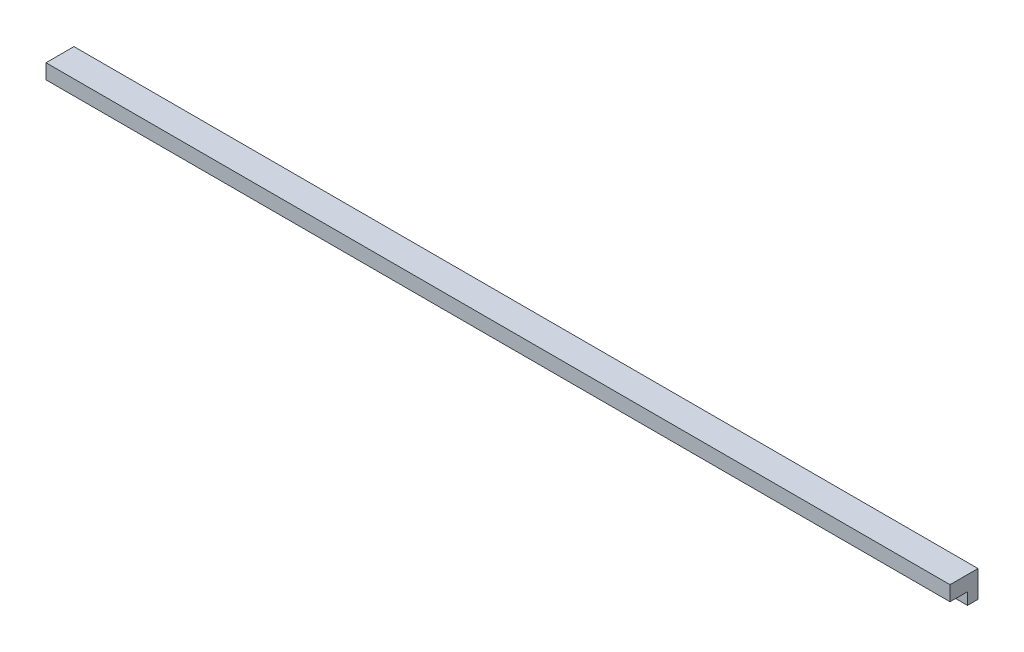
ISO-10303-21;
HEADER;
FILE_DESCRIPTION(('STEP AP214'),'2;1');
FILE_NAME('part.step','',(''),(''),'','','');
FILE_SCHEMA(('AUTOMOTIVE_DESIGN { 1 0 10303 214 1 1 1 1 }'));
ENDSEC;
DATA;
#1=APPLICATION_CONTEXT('core data for automotive mechanical design processes');
#2=APPLICATION_PROTOCOL_DEFINITION('international standard','automotive_design',2000,#1);
#3=PRODUCT_CONTEXT('',#1,'mechanical');
#4=PRODUCT('Part','Part','',(#3));
#5=PRODUCT_RELATED_PRODUCT_CATEGORY('part','',(#4));
#6=PRODUCT_DEFINITION_FORMATION('','',#4);
#7=PRODUCT_DEFINITION_CONTEXT('part definition',#1,'design');
#8=PRODUCT_DEFINITION('design','',#6,#7);
#9=PRODUCT_DEFINITION_SHAPE('','',#8);
#10=(LENGTH_UNIT() NAMED_UNIT(*) SI_UNIT(.MILLI.,.METRE.));
#11=(NAMED_UNIT(*) PLANE_ANGLE_UNIT() SI_UNIT($,.RADIAN.));
#12=(NAMED_UNIT(*) SI_UNIT($,.STERADIAN.) SOLID_ANGLE_UNIT());
#13=UNCERTAINTY_MEASURE_WITH_UNIT(LENGTH_MEASURE(1.E-05),#10,'distance_accuracy_value','');
#14=(GEOMETRIC_REPRESENTATION_CONTEXT(3) GLOBAL_UNCERTAINTY_ASSIGNED_CONTEXT((#13)) GLOBAL_UNIT_ASSIGNED_CONTEXT((#10,
#11,#12)) REPRESENTATION_CONTEXT('',''));
#15=CARTESIAN_POINT('',(0.,0.,0.));
#16=DIRECTION('',(0.,0.,1.));
#17=DIRECTION('',(1.,0.,0.));
#18=AXIS2_PLACEMENT_3D('',#15,#16,#17);
#19=CARTESIAN_POINT('',(1.69385725672636E-13,24.257,0.));
#20=DIRECTION('',(0.,1.,0.));
#21=DIRECTION('',(0.,0.,-1.));
#22=AXIS2_PLACEMENT_3D('',#19,#20,#21);
#23=PLANE('',#22);
#24=DIRECTION('',(0.,0.,1.));
#25=VECTOR('',#24,1.);
#26=CARTESIAN_POINT('',(410.36875,24.2570000000029,-257.175));
#27=LINE('',#26,#25);
#28=CARTESIAN_POINT('',(410.36875,24.2570000000029,-257.175));
#29=VERTEX_POINT('',#28);
#30=CARTESIAN_POINT('',(410.36875,24.2570000000029,-231.775));
#31=VERTEX_POINT('',#30);
#32=EDGE_CURVE('E40',#29,#31,#27,.T.);
#33=ORIENTED_EDGE('',*,*,#32,.F.);
#34=DIRECTION('',(1.,0.,0.));
#35=VECTOR('',#34,1.);
#36=CARTESIAN_POINT('',(410.36875,24.2570000000029,-257.175));
#37=LINE('',#36,#35);
#38=CARTESIAN_POINT('',(-410.36875,24.2569999999971,-257.175));
#39=VERTEX_POINT('',#38);
#40=EDGE_CURVE('E98',#39,#29,#37,.T.);
#41=ORIENTED_EDGE('',*,*,#40,.F.);
#42=DIRECTION('',(0.,0.,-1.));
#43=VECTOR('',#42,1.);
#44=CARTESIAN_POINT('',(-410.36875,24.2569999999971,-257.175));
#45=LINE('',#44,#43);
#46=CARTESIAN_POINT('',(-410.36875,24.2569999999971,-231.775));
#47=VERTEX_POINT('',#46);
#48=EDGE_CURVE('E73',#47,#39,#45,.T.);
#49=ORIENTED_EDGE('',*,*,#48,.F.);
#50=DIRECTION('',(-1.,0.,0.));
#51=VECTOR('',#50,1.);
#52=CARTESIAN_POINT('',(410.36875,24.2570000000029,-231.775));
#53=LINE('',#52,#51);
#54=EDGE_CURVE('E70',#31,#47,#53,.T.);
#55=ORIENTED_EDGE('',*,*,#54,.F.);
#56=EDGE_LOOP('',(#33,#41,#49,#55));
#57=FACE_BOUND('',#56,.T.);
#58=ADVANCED_FACE('F32',(#57),#23,.T.);
#59=CARTESIAN_POINT('',(2.63390369239648E-13,10.795,0.));
#60=DIRECTION('',(0.,-1.,0.));
#61=DIRECTION('',(0.,0.,1.));
#62=AXIS2_PLACEMENT_3D('',#59,#60,#61);
#63=PLANE('',#62);
#64=DIRECTION('',(-1.,0.,0.));
#65=VECTOR('',#64,1.);
#66=CARTESIAN_POINT('',(410.36875,10.7950000000029,-247.65));
#67=LINE('',#66,#65);
#68=CARTESIAN_POINT('',(410.36875,10.7950000000029,-247.65));
#69=VERTEX_POINT('',#68);
#70=CARTESIAN_POINT('',(-410.36875,10.7949999999971,-247.65));
#71=VERTEX_POINT('',#70);
#72=EDGE_CURVE('E48',#69,#71,#67,.T.);
#73=ORIENTED_EDGE('',*,*,#72,.F.);
#74=DIRECTION('',(0.,0.,1.));
#75=VECTOR('',#74,1.);
#76=CARTESIAN_POINT('',(410.36875,10.7950000000029,-257.175));
#77=LINE('',#76,#75);
#78=CARTESIAN_POINT('',(410.36875,10.7950000000029,-231.775));
#79=VERTEX_POINT('',#78);
#80=EDGE_CURVE('E53',#69,#79,#77,.T.);
#81=ORIENTED_EDGE('',*,*,#80,.T.);
#82=DIRECTION('',(-1.,0.,0.));
#83=VECTOR('',#82,1.);
#84=CARTESIAN_POINT('',(410.36875,10.7950000000029,-231.775));
#85=LINE('',#84,#83);
#86=CARTESIAN_POINT('',(-410.36875,10.7949999999971,-231.775));
#87=VERTEX_POINT('',#86);
#88=EDGE_CURVE('E133',#79,#87,#85,.T.);
#89=ORIENTED_EDGE('',*,*,#88,.T.);
#90=DIRECTION('',(0.,0.,-1.));
#91=VECTOR('',#90,1.);
#92=CARTESIAN_POINT('',(-410.36875,10.7949999999971,-257.175));
#93=LINE('',#92,#91);
#94=EDGE_CURVE('E127',#87,#71,#93,.T.);
#95=ORIENTED_EDGE('',*,*,#94,.T.);
#96=EDGE_LOOP('',(#73,#81,#89,#95));
#97=FACE_BOUND('',#96,.T.);
#98=ADVANCED_FACE('F151',(#97),#63,.T.);
#99=CARTESIAN_POINT('',(410.368749999995,845.387442686334,-231.775));
#100=DIRECTION('',(0.,0.,1.));
#101=DIRECTION('',(-1.,0.,0.));
#102=AXIS2_PLACEMENT_3D('',#99,#100,#101);
#103=PLANE('',#102);
#104=DIRECTION('',(0.,-1.,0.));
#105=VECTOR('',#104,1.);
#106=CARTESIAN_POINT('',(410.368749999995,845.387442686334,-231.775));
#107=LINE('',#106,#105);
#108=EDGE_CURVE('E11',#31,#79,#107,.T.);
#109=ORIENTED_EDGE('',*,*,#108,.F.);
#110=ORIENTED_EDGE('',*,*,#54,.T.);
#111=DIRECTION('',(0.,-1.,0.));
#112=VECTOR('',#111,1.);
#113=CARTESIAN_POINT('',(-410.368750000005,845.387442686328,-231.775));
#114=LINE('',#113,#112);
#115=EDGE_CURVE('E139',#47,#87,#114,.T.);
#116=ORIENTED_EDGE('',*,*,#115,.T.);
#117=ORIENTED_EDGE('',*,*,#88,.F.);
#118=EDGE_LOOP('',(#109,#110,#116,#117));
#119=FACE_BOUND('',#118,.T.);
#120=ADVANCED_FACE('F148',(#119),#103,.T.);
#121=CARTESIAN_POINT('',(-410.368750000005,845.387442686328,-257.175));
#122=DIRECTION('',(-1.,0.,0.));
#123=DIRECTION('',(0.,0.,-1.));
#124=AXIS2_PLACEMENT_3D('',#121,#122,#123);
#125=PLANE('',#124);
#126=ORIENTED_EDGE('',*,*,#115,.F.);
#127=ORIENTED_EDGE('',*,*,#48,.T.);
#128=DIRECTION('',(0.,-1.,0.));
#129=VECTOR('',#128,1.);
#130=CARTESIAN_POINT('',(-410.368750000005,845.387442686328,-257.175));
#131=LINE('',#130,#129);
#132=CARTESIAN_POINT('',(-410.36875,-2.86576318231369E-12,-257.175));
#133=VERTEX_POINT('',#132);
#134=EDGE_CURVE('E142',#39,#133,#131,.T.);
#135=ORIENTED_EDGE('',*,*,#134,.T.);
#136=DIRECTION('',(0.,0.,-1.));
#137=VECTOR('',#136,1.);
#138=CARTESIAN_POINT('',(-410.36875,-2.86576318231369E-12,-247.65));
#139=LINE('',#138,#137);
#140=CARTESIAN_POINT('',(-410.36875,-2.86576318231369E-12,-247.65));
#141=VERTEX_POINT('',#140);
#142=EDGE_CURVE('E114',#141,#133,#139,.T.);
#143=ORIENTED_EDGE('',*,*,#142,.F.);
#144=DIRECTION('',(0.,1.,0.));
#145=VECTOR('',#144,1.);
#146=CARTESIAN_POINT('',(-410.36875,3.17499999999714,-247.65));
#147=LINE('',#146,#145);
#148=EDGE_CURVE('E126',#141,#71,#147,.T.);
#149=ORIENTED_EDGE('',*,*,#148,.T.);
#150=ORIENTED_EDGE('',*,*,#94,.F.);
#151=EDGE_LOOP('',(#126,#127,#135,#143,#149,#150));
#152=FACE_BOUND('',#151,.T.);
#153=ADVANCED_FACE('F150',(#152),#125,.T.);
#154=CARTESIAN_POINT('',(410.368749999995,845.387442686334,-257.175));
#155=DIRECTION('',(0.,0.,-1.));
#156=DIRECTION('',(1.,0.,0.));
#157=AXIS2_PLACEMENT_3D('',#154,#155,#156);
#158=PLANE('',#157);
#159=ORIENTED_EDGE('',*,*,#134,.F.);
#160=ORIENTED_EDGE('',*,*,#40,.T.);
#161=DIRECTION('',(0.,-1.,0.));
#162=VECTOR('',#161,1.);
#163=CARTESIAN_POINT('',(410.368749999995,845.387442686334,-257.175));
#164=LINE('',#163,#162);
#165=CARTESIAN_POINT('',(410.36875,2.86576318231369E-12,-257.175));
#166=VERTEX_POINT('',#165);
#167=EDGE_CURVE('E92',#29,#166,#164,.T.);
#168=ORIENTED_EDGE('',*,*,#167,.T.);
#169=DIRECTION('',(1.,0.,0.));
#170=VECTOR('',#169,1.);
#171=CARTESIAN_POINT('',(-410.36875,-2.86576318231369E-12,-257.175));
#172=LINE('',#171,#170);
#173=EDGE_CURVE('E97',#133,#166,#172,.T.);
#174=ORIENTED_EDGE('',*,*,#173,.F.);
#175=EDGE_LOOP('',(#159,#160,#168,#174));
#176=FACE_BOUND('',#175,.T.);
#177=ADVANCED_FACE('F95',(#176),#158,.T.);
#178=CARTESIAN_POINT('',(410.368749999995,845.387442686334,-257.175));
#179=DIRECTION('',(1.,0.,0.));
#180=DIRECTION('',(0.,0.,1.));
#181=AXIS2_PLACEMENT_3D('',#178,#179,#180);
#182=PLANE('',#181);
#183=ORIENTED_EDGE('',*,*,#167,.F.);
#184=ORIENTED_EDGE('',*,*,#32,.T.);
#185=ORIENTED_EDGE('',*,*,#108,.T.);
#186=ORIENTED_EDGE('',*,*,#80,.F.);
#187=DIRECTION('',(0.,1.,0.));
#188=VECTOR('',#187,1.);
#189=CARTESIAN_POINT('',(410.36875,3.17500000000287,-247.65));
#190=LINE('',#189,#188);
#191=CARTESIAN_POINT('',(410.36875,2.86576318231369E-12,-247.65));
#192=VERTEX_POINT('',#191);
#193=EDGE_CURVE('E105',#192,#69,#190,.T.);
#194=ORIENTED_EDGE('',*,*,#193,.F.);
#195=DIRECTION('',(0.,0.,1.));
#196=VECTOR('',#195,1.);
#197=CARTESIAN_POINT('',(410.36875,2.86576318231369E-12,-257.175));
#198=LINE('',#197,#196);
#199=EDGE_CURVE('E102',#166,#192,#198,.T.);
#200=ORIENTED_EDGE('',*,*,#199,.F.);
#201=EDGE_LOOP('',(#183,#184,#185,#186,#194,#200));
#202=FACE_BOUND('',#201,.T.);
#203=ADVANCED_FACE('F103',(#202),#182,.T.);
#204=CARTESIAN_POINT('',(410.36875,3.17500000000287,-247.65));
#205=DIRECTION('',(0.,0.,-1.));
#206=DIRECTION('',(1.,0.,0.));
#207=AXIS2_PLACEMENT_3D('',#204,#205,#206);
#208=PLANE('',#207);
#209=ORIENTED_EDGE('',*,*,#72,.T.);
#210=ORIENTED_EDGE('',*,*,#148,.F.);
#211=DIRECTION('',(-1.,0.,0.));
#212=VECTOR('',#211,1.);
#213=CARTESIAN_POINT('',(410.36875,2.86576318231369E-12,-247.65));
#214=LINE('',#213,#212);
#215=EDGE_CURVE('E109',#192,#141,#214,.T.);
#216=ORIENTED_EDGE('',*,*,#215,.F.);
#217=ORIENTED_EDGE('',*,*,#193,.T.);
#218=EDGE_LOOP('',(#209,#210,#216,#217));
#219=FACE_BOUND('',#218,.T.);
#220=ADVANCED_FACE('F160',(#219),#208,.F.);
#221=CARTESIAN_POINT('',(3.38771451345272E-13,0.,0.));
#222=DIRECTION('',(0.,-1.,0.));
#223=DIRECTION('',(0.,0.,1.));
#224=AXIS2_PLACEMENT_3D('',#221,#222,#223);
#225=PLANE('',#224);
#226=ORIENTED_EDGE('',*,*,#173,.T.);
#227=ORIENTED_EDGE('',*,*,#199,.T.);
#228=ORIENTED_EDGE('',*,*,#215,.T.);
#229=ORIENTED_EDGE('',*,*,#142,.T.);
#230=EDGE_LOOP('',(#226,#227,#228,#229));
#231=FACE_BOUND('',#230,.T.);
#232=ADVANCED_FACE('F112',(#231),#225,.T.);
#233=CLOSED_SHELL('',(#58,#98,#120,#153,#177,#203,#220,#232));
#234=MANIFOLD_SOLID_BREP('B2',#233);
#235=ADVANCED_BREP_SHAPE_REPRESENTATION('',(#18,#234),#14);
#236=SHAPE_DEFINITION_REPRESENTATION(#9,#235);
ENDSEC;
END-ISO-10303-21;
